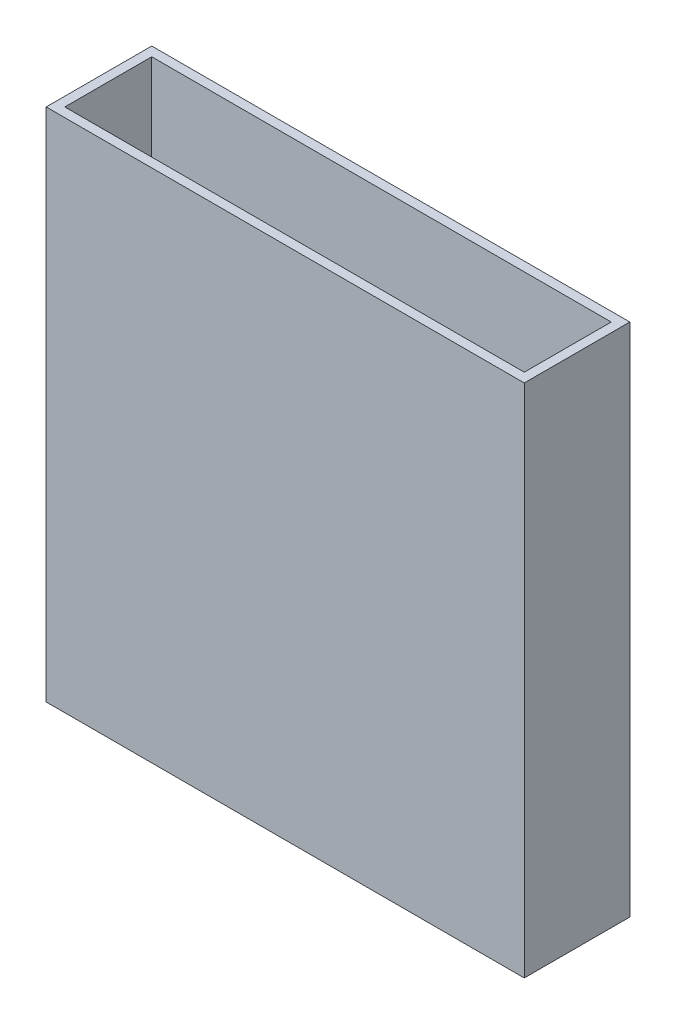
ISO-10303-21;
HEADER;
FILE_DESCRIPTION(('STEP AP214'),'2;1');
FILE_NAME('part.step','',(''),(''),'','','');
FILE_SCHEMA(('AUTOMOTIVE_DESIGN { 1 0 10303 214 1 1 1 1 }'));
ENDSEC;
DATA;
#1=APPLICATION_CONTEXT('core data for automotive mechanical design processes');
#2=APPLICATION_PROTOCOL_DEFINITION('international standard','automotive_design',2000,#1);
#3=PRODUCT_CONTEXT('',#1,'mechanical');
#4=PRODUCT('Part','Part','',(#3));
#5=PRODUCT_RELATED_PRODUCT_CATEGORY('part','',(#4));
#6=PRODUCT_DEFINITION_FORMATION('','',#4);
#7=PRODUCT_DEFINITION_CONTEXT('part definition',#1,'design');
#8=PRODUCT_DEFINITION('design','',#6,#7);
#9=PRODUCT_DEFINITION_SHAPE('','',#8);
#10=(LENGTH_UNIT() NAMED_UNIT(*) SI_UNIT(.MILLI.,.METRE.));
#11=(NAMED_UNIT(*) PLANE_ANGLE_UNIT() SI_UNIT($,.RADIAN.));
#12=(NAMED_UNIT(*) SI_UNIT($,.STERADIAN.) SOLID_ANGLE_UNIT());
#13=UNCERTAINTY_MEASURE_WITH_UNIT(LENGTH_MEASURE(1.E-05),#10,'distance_accuracy_value','');
#14=(GEOMETRIC_REPRESENTATION_CONTEXT(3) GLOBAL_UNCERTAINTY_ASSIGNED_CONTEXT((#13)) GLOBAL_UNIT_ASSIGNED_CONTEXT((#10,
#11,#12)) REPRESENTATION_CONTEXT('',''));
#15=CARTESIAN_POINT('',(0.,0.,0.));
#16=DIRECTION('',(0.,0.,1.));
#17=DIRECTION('',(1.,0.,0.));
#18=AXIS2_PLACEMENT_3D('',#15,#16,#17);
#19=CARTESIAN_POINT('',(0.,83.,0.));
#20=DIRECTION('',(0.,-1.,0.));
#21=DIRECTION('',(0.,0.,-1.));
#22=AXIS2_PLACEMENT_3D('',#19,#20,#21);
#23=PLANE('',#22);
#24=DIRECTION('',(0.,0.,-1.));
#25=VECTOR('',#24,1.);
#26=CARTESIAN_POINT('',(-38.5,83.,8.5));
#27=LINE('',#26,#25);
#28=CARTESIAN_POINT('',(-38.5,83.,8.5));
#29=VERTEX_POINT('',#28);
#30=CARTESIAN_POINT('',(-38.5,83.,-8.5));
#31=VERTEX_POINT('',#30);
#32=EDGE_CURVE('E136',#29,#31,#27,.T.);
#33=ORIENTED_EDGE('',*,*,#32,.F.);
#34=DIRECTION('',(1.,0.,0.));
#35=VECTOR('',#34,1.);
#36=CARTESIAN_POINT('',(-38.5,83.,8.5));
#37=LINE('',#36,#35);
#38=CARTESIAN_POINT('',(38.5,83.,8.5));
#39=VERTEX_POINT('',#38);
#40=EDGE_CURVE('E143',#29,#39,#37,.T.);
#41=ORIENTED_EDGE('',*,*,#40,.T.);
#42=DIRECTION('',(0.,0.,-1.));
#43=VECTOR('',#42,1.);
#44=CARTESIAN_POINT('',(38.5,83.,8.5));
#45=LINE('',#44,#43);
#46=CARTESIAN_POINT('',(38.5,83.,-8.5));
#47=VERTEX_POINT('',#46);
#48=EDGE_CURVE('E141',#39,#47,#45,.T.);
#49=ORIENTED_EDGE('',*,*,#48,.T.);
#50=DIRECTION('',(1.,0.,0.));
#51=VECTOR('',#50,1.);
#52=CARTESIAN_POINT('',(-38.5,83.,-8.5));
#53=LINE('',#52,#51);
#54=EDGE_CURVE('E138',#31,#47,#53,.T.);
#55=ORIENTED_EDGE('',*,*,#54,.F.);
#56=EDGE_LOOP('',(#33,#41,#49,#55));
#57=FACE_BOUND('',#56,.T.);
#58=DIRECTION('',(0.,0.,-1.));
#59=VECTOR('',#58,1.);
#60=CARTESIAN_POINT('',(-37.,83.,7.));
#61=LINE('',#60,#59);
#62=CARTESIAN_POINT('',(-37.,83.,7.));
#63=VERTEX_POINT('',#62);
#64=CARTESIAN_POINT('',(-37.,83.,-7.));
#65=VERTEX_POINT('',#64);
#66=EDGE_CURVE('E50',#63,#65,#61,.T.);
#67=ORIENTED_EDGE('',*,*,#66,.T.);
#68=DIRECTION('',(1.,0.,0.));
#69=VECTOR('',#68,1.);
#70=CARTESIAN_POINT('',(-37.,83.,-7.));
#71=LINE('',#70,#69);
#72=CARTESIAN_POINT('',(37.,83.,-7.));
#73=VERTEX_POINT('',#72);
#74=EDGE_CURVE('E125',#65,#73,#71,.T.);
#75=ORIENTED_EDGE('',*,*,#74,.T.);
#76=DIRECTION('',(0.,0.,-1.));
#77=VECTOR('',#76,1.);
#78=CARTESIAN_POINT('',(37.,83.,7.));
#79=LINE('',#78,#77);
#80=CARTESIAN_POINT('',(37.,83.,7.));
#81=VERTEX_POINT('',#80);
#82=EDGE_CURVE('E172',#81,#73,#79,.T.);
#83=ORIENTED_EDGE('',*,*,#82,.F.);
#84=DIRECTION('',(1.,0.,0.));
#85=VECTOR('',#84,1.);
#86=CARTESIAN_POINT('',(-37.,83.,7.));
#87=LINE('',#86,#85);
#88=EDGE_CURVE('E121',#63,#81,#87,.T.);
#89=ORIENTED_EDGE('',*,*,#88,.F.);
#90=EDGE_LOOP('',(#67,#75,#83,#89));
#91=FACE_BOUND('',#90,.T.);
#92=ADVANCED_FACE('F33',(#57,#91),#23,.F.);
#93=CARTESIAN_POINT('',(-38.5,83.,8.5));
#94=DIRECTION('',(-1.,0.,0.));
#95=DIRECTION('',(0.,0.,1.));
#96=AXIS2_PLACEMENT_3D('',#93,#94,#95);
#97=PLANE('',#96);
#98=DIRECTION('',(0.,0.,-1.));
#99=VECTOR('',#98,1.);
#100=CARTESIAN_POINT('',(-38.5,0.,8.5));
#101=LINE('',#100,#99);
#102=CARTESIAN_POINT('',(-38.5,0.,8.5));
#103=VERTEX_POINT('',#102);
#104=CARTESIAN_POINT('',(-38.5,0.,-8.5));
#105=VERTEX_POINT('',#104);
#106=EDGE_CURVE('E126',#103,#105,#101,.T.);
#107=ORIENTED_EDGE('',*,*,#106,.F.);
#108=DIRECTION('',(0.,-1.,0.));
#109=VECTOR('',#108,1.);
#110=CARTESIAN_POINT('',(-38.5,83.,8.5));
#111=LINE('',#110,#109);
#112=EDGE_CURVE('E11',#29,#103,#111,.T.);
#113=ORIENTED_EDGE('',*,*,#112,.F.);
#114=ORIENTED_EDGE('',*,*,#32,.T.);
#115=DIRECTION('',(0.,-1.,0.));
#116=VECTOR('',#115,1.);
#117=CARTESIAN_POINT('',(-38.5,83.,-8.5));
#118=LINE('',#117,#116);
#119=EDGE_CURVE('E37',#31,#105,#118,.T.);
#120=ORIENTED_EDGE('',*,*,#119,.T.);
#121=EDGE_LOOP('',(#107,#113,#114,#120));
#122=FACE_BOUND('',#121,.T.);
#123=ADVANCED_FACE('F35',(#122),#97,.T.);
#124=CARTESIAN_POINT('',(-38.5,83.,8.5));
#125=DIRECTION('',(0.,0.,-1.));
#126=DIRECTION('',(-1.,0.,0.));
#127=AXIS2_PLACEMENT_3D('',#124,#125,#126);
#128=PLANE('',#127);
#129=DIRECTION('',(1.,0.,0.));
#130=VECTOR('',#129,1.);
#131=CARTESIAN_POINT('',(-38.5,0.,8.5));
#132=LINE('',#131,#130);
#133=CARTESIAN_POINT('',(38.5,0.,8.5));
#134=VERTEX_POINT('',#133);
#135=EDGE_CURVE('E139',#103,#134,#132,.T.);
#136=ORIENTED_EDGE('',*,*,#135,.T.);
#137=DIRECTION('',(0.,-1.,0.));
#138=VECTOR('',#137,1.);
#139=CARTESIAN_POINT('',(38.5,83.,8.5));
#140=LINE('',#139,#138);
#141=EDGE_CURVE('E42',#39,#134,#140,.T.);
#142=ORIENTED_EDGE('',*,*,#141,.F.);
#143=ORIENTED_EDGE('',*,*,#40,.F.);
#144=ORIENTED_EDGE('',*,*,#112,.T.);
#145=EDGE_LOOP('',(#136,#142,#143,#144));
#146=FACE_BOUND('',#145,.T.);
#147=ADVANCED_FACE('F160',(#146),#128,.F.);
#148=CARTESIAN_POINT('',(38.5,83.,8.5));
#149=DIRECTION('',(-1.,0.,0.));
#150=DIRECTION('',(0.,0.,1.));
#151=AXIS2_PLACEMENT_3D('',#148,#149,#150);
#152=PLANE('',#151);
#153=DIRECTION('',(0.,0.,-1.));
#154=VECTOR('',#153,1.);
#155=CARTESIAN_POINT('',(38.5,0.,8.5));
#156=LINE('',#155,#154);
#157=CARTESIAN_POINT('',(38.5,0.,-8.5));
#158=VERTEX_POINT('',#157);
#159=EDGE_CURVE('E147',#134,#158,#156,.T.);
#160=ORIENTED_EDGE('',*,*,#159,.T.);
#161=DIRECTION('',(0.,-1.,0.));
#162=VECTOR('',#161,1.);
#163=CARTESIAN_POINT('',(38.5,83.,-8.5));
#164=LINE('',#163,#162);
#165=EDGE_CURVE('E152',#47,#158,#164,.T.);
#166=ORIENTED_EDGE('',*,*,#165,.F.);
#167=ORIENTED_EDGE('',*,*,#48,.F.);
#168=ORIENTED_EDGE('',*,*,#141,.T.);
#169=EDGE_LOOP('',(#160,#166,#167,#168));
#170=FACE_BOUND('',#169,.T.);
#171=ADVANCED_FACE('F163',(#170),#152,.F.);
#172=CARTESIAN_POINT('',(-38.5,83.,-8.5));
#173=DIRECTION('',(0.,0.,-1.));
#174=DIRECTION('',(-1.,0.,0.));
#175=AXIS2_PLACEMENT_3D('',#172,#173,#174);
#176=PLANE('',#175);
#177=DIRECTION('',(1.,0.,0.));
#178=VECTOR('',#177,1.);
#179=CARTESIAN_POINT('',(-38.5,0.,-8.5));
#180=LINE('',#179,#178);
#181=EDGE_CURVE('E130',#105,#158,#180,.T.);
#182=ORIENTED_EDGE('',*,*,#181,.F.);
#183=ORIENTED_EDGE('',*,*,#119,.F.);
#184=ORIENTED_EDGE('',*,*,#54,.T.);
#185=ORIENTED_EDGE('',*,*,#165,.T.);
#186=EDGE_LOOP('',(#182,#183,#184,#185));
#187=FACE_BOUND('',#186,.T.);
#188=ADVANCED_FACE('F155',(#187),#176,.T.);
#189=CARTESIAN_POINT('',(0.,0.,0.));
#190=DIRECTION('',(0.,-1.,0.));
#191=DIRECTION('',(0.,0.,-1.));
#192=AXIS2_PLACEMENT_3D('',#189,#190,#191);
#193=PLANE('',#192);
#194=ORIENTED_EDGE('',*,*,#106,.T.);
#195=ORIENTED_EDGE('',*,*,#181,.T.);
#196=ORIENTED_EDGE('',*,*,#159,.F.);
#197=ORIENTED_EDGE('',*,*,#135,.F.);
#198=EDGE_LOOP('',(#194,#195,#196,#197));
#199=FACE_BOUND('',#198,.T.);
#200=ADVANCED_FACE('F158',(#199),#193,.T.);
#201=CARTESIAN_POINT('',(-37.,3.,7.));
#202=DIRECTION('',(1.,0.,0.));
#203=DIRECTION('',(0.,0.,-1.));
#204=AXIS2_PLACEMENT_3D('',#201,#202,#203);
#205=PLANE('',#204);
#206=ORIENTED_EDGE('',*,*,#66,.F.);
#207=DIRECTION('',(0.,1.,0.));
#208=VECTOR('',#207,1.);
#209=CARTESIAN_POINT('',(-37.,3.,7.));
#210=LINE('',#209,#208);
#211=CARTESIAN_POINT('',(-37.,3.,7.));
#212=VERTEX_POINT('',#211);
#213=EDGE_CURVE('E120',#212,#63,#210,.T.);
#214=ORIENTED_EDGE('',*,*,#213,.F.);
#215=DIRECTION('',(0.,0.,-1.));
#216=VECTOR('',#215,1.);
#217=CARTESIAN_POINT('',(-37.,3.,7.));
#218=LINE('',#217,#216);
#219=CARTESIAN_POINT('',(-37.,3.,-7.));
#220=VERTEX_POINT('',#219);
#221=EDGE_CURVE('E110',#212,#220,#218,.T.);
#222=ORIENTED_EDGE('',*,*,#221,.T.);
#223=DIRECTION('',(0.,1.,0.));
#224=VECTOR('',#223,1.);
#225=CARTESIAN_POINT('',(-37.,3.,-7.));
#226=LINE('',#225,#224);
#227=EDGE_CURVE('E119',#220,#65,#226,.T.);
#228=ORIENTED_EDGE('',*,*,#227,.T.);
#229=EDGE_LOOP('',(#206,#214,#222,#228));
#230=FACE_BOUND('',#229,.T.);
#231=ADVANCED_FACE('F118',(#230),#205,.T.);
#232=CARTESIAN_POINT('',(-37.,3.,-7.));
#233=DIRECTION('',(0.,0.,1.));
#234=DIRECTION('',(1.,0.,0.));
#235=AXIS2_PLACEMENT_3D('',#232,#233,#234);
#236=PLANE('',#235);
#237=ORIENTED_EDGE('',*,*,#74,.F.);
#238=ORIENTED_EDGE('',*,*,#227,.F.);
#239=DIRECTION('',(1.,0.,0.));
#240=VECTOR('',#239,1.);
#241=CARTESIAN_POINT('',(-37.,3.,-7.));
#242=LINE('',#241,#240);
#243=CARTESIAN_POINT('',(37.,3.,-7.));
#244=VERTEX_POINT('',#243);
#245=EDGE_CURVE('E106',#220,#244,#242,.T.);
#246=ORIENTED_EDGE('',*,*,#245,.T.);
#247=DIRECTION('',(0.,1.,0.));
#248=VECTOR('',#247,1.);
#249=CARTESIAN_POINT('',(37.,3.,-7.));
#250=LINE('',#249,#248);
#251=EDGE_CURVE('E127',#244,#73,#250,.T.);
#252=ORIENTED_EDGE('',*,*,#251,.T.);
#253=EDGE_LOOP('',(#237,#238,#246,#252));
#254=FACE_BOUND('',#253,.T.);
#255=ADVANCED_FACE('F123',(#254),#236,.T.);
#256=CARTESIAN_POINT('',(37.,3.,7.));
#257=DIRECTION('',(1.,0.,0.));
#258=DIRECTION('',(0.,0.,-1.));
#259=AXIS2_PLACEMENT_3D('',#256,#257,#258);
#260=PLANE('',#259);
#261=ORIENTED_EDGE('',*,*,#82,.T.);
#262=ORIENTED_EDGE('',*,*,#251,.F.);
#263=DIRECTION('',(0.,0.,-1.));
#264=VECTOR('',#263,1.);
#265=CARTESIAN_POINT('',(37.,3.,7.));
#266=LINE('',#265,#264);
#267=CARTESIAN_POINT('',(37.,3.,7.));
#268=VERTEX_POINT('',#267);
#269=EDGE_CURVE('E113',#268,#244,#266,.T.);
#270=ORIENTED_EDGE('',*,*,#269,.F.);
#271=DIRECTION('',(0.,1.,0.));
#272=VECTOR('',#271,1.);
#273=CARTESIAN_POINT('',(37.,3.,7.));
#274=LINE('',#273,#272);
#275=EDGE_CURVE('E132',#268,#81,#274,.T.);
#276=ORIENTED_EDGE('',*,*,#275,.T.);
#277=EDGE_LOOP('',(#261,#262,#270,#276));
#278=FACE_BOUND('',#277,.T.);
#279=ADVANCED_FACE('F182',(#278),#260,.F.);
#280=CARTESIAN_POINT('',(-37.,3.,7.));
#281=DIRECTION('',(0.,0.,1.));
#282=DIRECTION('',(1.,0.,0.));
#283=AXIS2_PLACEMENT_3D('',#280,#281,#282);
#284=PLANE('',#283);
#285=ORIENTED_EDGE('',*,*,#88,.T.);
#286=ORIENTED_EDGE('',*,*,#275,.F.);
#287=DIRECTION('',(1.,0.,0.));
#288=VECTOR('',#287,1.);
#289=CARTESIAN_POINT('',(-37.,3.,7.));
#290=LINE('',#289,#288);
#291=EDGE_CURVE('E175',#212,#268,#290,.T.);
#292=ORIENTED_EDGE('',*,*,#291,.F.);
#293=ORIENTED_EDGE('',*,*,#213,.T.);
#294=EDGE_LOOP('',(#285,#286,#292,#293));
#295=FACE_BOUND('',#294,.T.);
#296=ADVANCED_FACE('F184',(#295),#284,.F.);
#297=CARTESIAN_POINT('',(0.,3.,0.));
#298=DIRECTION('',(0.,-1.,0.));
#299=DIRECTION('',(0.,0.,-1.));
#300=AXIS2_PLACEMENT_3D('',#297,#298,#299);
#301=PLANE('',#300);
#302=ORIENTED_EDGE('',*,*,#221,.F.);
#303=ORIENTED_EDGE('',*,*,#291,.T.);
#304=ORIENTED_EDGE('',*,*,#269,.T.);
#305=ORIENTED_EDGE('',*,*,#245,.F.);
#306=EDGE_LOOP('',(#302,#303,#304,#305));
#307=FACE_BOUND('',#306,.T.);
#308=ADVANCED_FACE('F108',(#307),#301,.F.);
#309=CLOSED_SHELL('',(#92,#123,#147,#171,#188,#200,#231,#255,#279,#296,#308));
#310=MANIFOLD_SOLID_BREP('B2',#309);
#311=ADVANCED_BREP_SHAPE_REPRESENTATION('',(#18,#310),#14);
#312=SHAPE_DEFINITION_REPRESENTATION(#9,#311);
ENDSEC;
END-ISO-10303-21;
